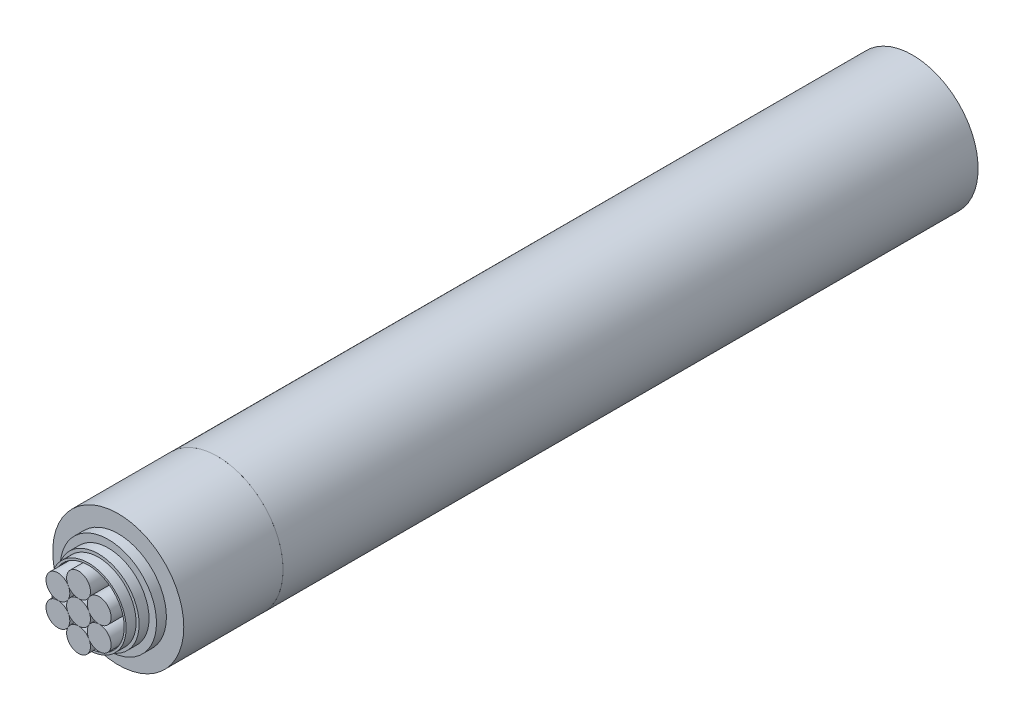
ISO-10303-21;
HEADER;
FILE_DESCRIPTION(('STEP AP214'),'2;1');
FILE_NAME('part.step','',(''),(''),'','','');
FILE_SCHEMA(('AUTOMOTIVE_DESIGN { 1 0 10303 214 1 1 1 1 }'));
ENDSEC;
DATA;
#1=APPLICATION_CONTEXT('core data for automotive mechanical design processes');
#2=APPLICATION_PROTOCOL_DEFINITION('international standard','automotive_design',2000,#1);
#3=PRODUCT_CONTEXT('',#1,'mechanical');
#4=PRODUCT('Part','Part','',(#3));
#5=PRODUCT_RELATED_PRODUCT_CATEGORY('part','',(#4));
#6=PRODUCT_DEFINITION_FORMATION('','',#4);
#7=PRODUCT_DEFINITION_CONTEXT('part definition',#1,'design');
#8=PRODUCT_DEFINITION('design','',#6,#7);
#9=PRODUCT_DEFINITION_SHAPE('','',#8);
#10=(LENGTH_UNIT() NAMED_UNIT(*) SI_UNIT(.MILLI.,.METRE.));
#11=(NAMED_UNIT(*) PLANE_ANGLE_UNIT() SI_UNIT($,.RADIAN.));
#12=(NAMED_UNIT(*) SI_UNIT($,.STERADIAN.) SOLID_ANGLE_UNIT());
#13=UNCERTAINTY_MEASURE_WITH_UNIT(LENGTH_MEASURE(1.E-05),#10,'distance_accuracy_value','');
#14=(GEOMETRIC_REPRESENTATION_CONTEXT(3) GLOBAL_UNCERTAINTY_ASSIGNED_CONTEXT((#13)) GLOBAL_UNIT_ASSIGNED_CONTEXT((#10,
#11,#12)) REPRESENTATION_CONTEXT('',''));
#15=CARTESIAN_POINT('',(0.,0.,0.));
#16=DIRECTION('',(0.,0.,1.));
#17=DIRECTION('',(1.,0.,0.));
#18=AXIS2_PLACEMENT_3D('',#15,#16,#17);
#19=CARTESIAN_POINT('',(0.,0.,-35.));
#20=DIRECTION('',(0.,0.,1.));
#21=DIRECTION('',(1.,0.,0.));
#22=AXIS2_PLACEMENT_3D('',#19,#20,#21);
#23=CYLINDRICAL_SURFACE('',#22,3.3);
#24=CARTESIAN_POINT('',(0.,0.,-35.));
#25=DIRECTION('',(0.,0.,-1.));
#26=DIRECTION('',(-1.,0.,0.));
#27=AXIS2_PLACEMENT_3D('',#24,#25,#26);
#28=CIRCLE('',#27,3.3);
#29=CARTESIAN_POINT('',(-3.3,0.,-35.));
#30=VERTEX_POINT('',#29);
#31=EDGE_CURVE('E12',#30,#30,#28,.T.);
#32=ORIENTED_EDGE('',*,*,#31,.F.);
#33=EDGE_LOOP('',(#32));
#34=FACE_BOUND('',#33,.T.);
#35=CARTESIAN_POINT('',(0.,0.,0.));
#36=DIRECTION('',(0.,0.,-1.));
#37=DIRECTION('',(-1.,0.,0.));
#38=AXIS2_PLACEMENT_3D('',#35,#36,#37);
#39=CIRCLE('',#38,3.3);
#40=CARTESIAN_POINT('',(-3.3,0.,0.));
#41=VERTEX_POINT('',#40);
#42=EDGE_CURVE('E125',#41,#41,#39,.T.);
#43=ORIENTED_EDGE('',*,*,#42,.T.);
#44=EDGE_LOOP('',(#43));
#45=FACE_BOUND('',#44,.T.);
#46=ADVANCED_FACE('F122',(#34,#45),#23,.T.);
#47=CARTESIAN_POINT('',(0.,0.,-35.));
#48=DIRECTION('',(0.,0.,-1.));
#49=DIRECTION('',(-1.,0.,0.));
#50=AXIS2_PLACEMENT_3D('',#47,#48,#49);
#51=PLANE('',#50);
#52=ORIENTED_EDGE('',*,*,#31,.T.);
#53=EDGE_LOOP('',(#52));
#54=FACE_BOUND('',#53,.T.);
#55=ADVANCED_FACE('F139',(#54),#51,.T.);
#56=CARTESIAN_POINT('',(0.,0.,0.));
#57=DIRECTION('',(0.,0.,-1.));
#58=DIRECTION('',(-1.,0.,0.));
#59=AXIS2_PLACEMENT_3D('',#56,#57,#58);
#60=PLANE('',#59);
#61=ORIENTED_EDGE('',*,*,#42,.F.);
#62=EDGE_LOOP('',(#61));
#63=FACE_BOUND('',#62,.T.);
#64=ADVANCED_FACE('F137',(#63),#60,.F.);
#65=CLOSED_SHELL('',(#46,#55,#64));
#66=MANIFOLD_SOLID_BREP('B2',#65);
#67=CARTESIAN_POINT('',(0.,0.,5.));
#68=DIRECTION('',(0.,0.,-1.));
#69=DIRECTION('',(-1.,0.,0.));
#70=AXIS2_PLACEMENT_3D('',#67,#68,#69);
#71=CYLINDRICAL_SURFACE('',#70,3.3);
#72=CARTESIAN_POINT('',(0.,0.,5.));
#73=DIRECTION('',(0.,0.,1.));
#74=DIRECTION('',(1.,0.,0.));
#75=AXIS2_PLACEMENT_3D('',#72,#73,#74);
#76=CIRCLE('',#75,3.3);
#77=CARTESIAN_POINT('',(3.3,0.,5.));
#78=VERTEX_POINT('',#77);
#79=EDGE_CURVE('E121',#78,#78,#76,.T.);
#80=ORIENTED_EDGE('',*,*,#79,.F.);
#81=EDGE_LOOP('',(#80));
#82=FACE_BOUND('',#81,.T.);
#83=CARTESIAN_POINT('',(0.,0.,0.));
#84=DIRECTION('',(0.,0.,1.));
#85=DIRECTION('',(1.,0.,0.));
#86=AXIS2_PLACEMENT_3D('',#83,#84,#85);
#87=CIRCLE('',#86,3.3);
#88=CARTESIAN_POINT('',(3.3,0.,0.));
#89=VERTEX_POINT('',#88);
#90=EDGE_CURVE('E175',#89,#89,#87,.T.);
#91=ORIENTED_EDGE('',*,*,#90,.T.);
#92=EDGE_LOOP('',(#91));
#93=FACE_BOUND('',#92,.T.);
#94=ADVANCED_FACE('F172',(#82,#93),#71,.T.);
#95=CARTESIAN_POINT('',(0.,0.,5.));
#96=DIRECTION('',(0.,0.,1.));
#97=DIRECTION('',(1.,0.,0.));
#98=AXIS2_PLACEMENT_3D('',#95,#96,#97);
#99=PLANE('',#98);
#100=CARTESIAN_POINT('',(0.,0.,5.));
#101=DIRECTION('',(0.,0.,1.));
#102=DIRECTION('',(1.,0.,0.));
#103=AXIS2_PLACEMENT_3D('',#100,#101,#102);
#104=CIRCLE('',#103,2.42499999999999);
#105=CARTESIAN_POINT('',(2.42499999999999,0.,5.));
#106=VERTEX_POINT('',#105);
#107=EDGE_CURVE('E179',#106,#106,#104,.T.);
#108=ORIENTED_EDGE('',*,*,#107,.F.);
#109=EDGE_LOOP('',(#108));
#110=FACE_BOUND('',#109,.T.);
#111=ORIENTED_EDGE('',*,*,#79,.T.);
#112=EDGE_LOOP('',(#111));
#113=FACE_BOUND('',#112,.T.);
#114=ADVANCED_FACE('F226',(#110,#113),#99,.T.);
#115=CARTESIAN_POINT('',(0.,0.,0.));
#116=DIRECTION('',(0.,0.,1.));
#117=DIRECTION('',(1.,0.,0.));
#118=AXIS2_PLACEMENT_3D('',#115,#116,#117);
#119=PLANE('',#118);
#120=ORIENTED_EDGE('',*,*,#90,.F.);
#121=EDGE_LOOP('',(#120));
#122=FACE_BOUND('',#121,.T.);
#123=CARTESIAN_POINT('',(0.,0.,0.));
#124=DIRECTION('',(0.,0.,1.));
#125=DIRECTION('',(1.,0.,0.));
#126=AXIS2_PLACEMENT_3D('',#123,#124,#125);
#127=CIRCLE('',#126,1.79999999999998);
#128=CARTESIAN_POINT('',(-1.79999999999998,0.,0.));
#129=VERTEX_POINT('',#128);
#130=EDGE_CURVE('E198',#129,#129,#127,.T.);
#131=ORIENTED_EDGE('',*,*,#130,.T.);
#132=EDGE_LOOP('',(#131));
#133=FACE_BOUND('',#132,.T.);
#134=ADVANCED_FACE('F231',(#122,#133),#119,.F.);
#135=CARTESIAN_POINT('',(0.,0.,5.5));
#136=DIRECTION('',(0.,0.,-1.));
#137=DIRECTION('',(-1.,0.,0.));
#138=AXIS2_PLACEMENT_3D('',#135,#136,#137);
#139=CYLINDRICAL_SURFACE('',#138,2.42499999999999);
#140=ORIENTED_EDGE('',*,*,#107,.T.);
#141=EDGE_LOOP('',(#140));
#142=FACE_BOUND('',#141,.T.);
#143=CARTESIAN_POINT('',(0.,0.,5.5));
#144=DIRECTION('',(0.,0.,1.));
#145=DIRECTION('',(1.,0.,0.));
#146=AXIS2_PLACEMENT_3D('',#143,#144,#145);
#147=CIRCLE('',#146,2.42499999999999);
#148=CARTESIAN_POINT('',(2.42499999999999,0.,5.5));
#149=VERTEX_POINT('',#148);
#150=EDGE_CURVE('E185',#149,#149,#147,.T.);
#151=ORIENTED_EDGE('',*,*,#150,.F.);
#152=EDGE_LOOP('',(#151));
#153=FACE_BOUND('',#152,.T.);
#154=ADVANCED_FACE('F240',(#142,#153),#139,.T.);
#155=CARTESIAN_POINT('',(0.,0.,5.5));
#156=DIRECTION('',(0.,0.,1.));
#157=DIRECTION('',(1.,0.,0.));
#158=AXIS2_PLACEMENT_3D('',#155,#156,#157);
#159=PLANE('',#158);
#160=CARTESIAN_POINT('',(0.,0.,5.5));
#161=DIRECTION('',(0.,0.,1.));
#162=DIRECTION('',(1.,0.,0.));
#163=AXIS2_PLACEMENT_3D('',#160,#161,#162);
#164=CIRCLE('',#163,2.04999999999999);
#165=CARTESIAN_POINT('',(2.04999999999999,0.,5.5));
#166=VERTEX_POINT('',#165);
#167=EDGE_CURVE('E188',#166,#166,#164,.T.);
#168=ORIENTED_EDGE('',*,*,#167,.F.);
#169=EDGE_LOOP('',(#168));
#170=FACE_BOUND('',#169,.T.);
#171=ORIENTED_EDGE('',*,*,#150,.T.);
#172=EDGE_LOOP('',(#171));
#173=FACE_BOUND('',#172,.T.);
#174=ADVANCED_FACE('F245',(#170,#173),#159,.T.);
#175=CARTESIAN_POINT('',(0.,0.,6.));
#176=DIRECTION('',(0.,0.,-1.));
#177=DIRECTION('',(-1.,0.,0.));
#178=AXIS2_PLACEMENT_3D('',#175,#176,#177);
#179=CYLINDRICAL_SURFACE('',#178,2.04999999999999);
#180=ORIENTED_EDGE('',*,*,#167,.T.);
#181=EDGE_LOOP('',(#180));
#182=FACE_BOUND('',#181,.T.);
#183=CARTESIAN_POINT('',(0.,0.,6.));
#184=DIRECTION('',(0.,0.,1.));
#185=DIRECTION('',(1.,0.,0.));
#186=AXIS2_PLACEMENT_3D('',#183,#184,#185);
#187=CIRCLE('',#186,2.04999999999999);
#188=CARTESIAN_POINT('',(2.04999999999999,0.,6.));
#189=VERTEX_POINT('',#188);
#190=EDGE_CURVE('E191',#189,#189,#187,.T.);
#191=ORIENTED_EDGE('',*,*,#190,.F.);
#192=EDGE_LOOP('',(#191));
#193=FACE_BOUND('',#192,.T.);
#194=ADVANCED_FACE('F251',(#182,#193),#179,.T.);
#195=CARTESIAN_POINT('',(0.,0.,6.));
#196=DIRECTION('',(0.,0.,1.));
#197=DIRECTION('',(1.,0.,0.));
#198=AXIS2_PLACEMENT_3D('',#195,#196,#197);
#199=PLANE('',#198);
#200=CARTESIAN_POINT('',(0.,0.,6.));
#201=DIRECTION('',(0.,0.,1.));
#202=DIRECTION('',(1.,0.,0.));
#203=AXIS2_PLACEMENT_3D('',#200,#201,#202);
#204=CIRCLE('',#203,1.89999999999999);
#205=CARTESIAN_POINT('',(-1.89999999999999,0.,6.));
#206=VERTEX_POINT('',#205);
#207=EDGE_CURVE('E194',#206,#206,#204,.T.);
#208=ORIENTED_EDGE('',*,*,#207,.F.);
#209=EDGE_LOOP('',(#208));
#210=FACE_BOUND('',#209,.T.);
#211=ORIENTED_EDGE('',*,*,#190,.T.);
#212=EDGE_LOOP('',(#211));
#213=FACE_BOUND('',#212,.T.);
#214=ADVANCED_FACE('F223',(#210,#213),#199,.T.);
#215=CARTESIAN_POINT('',(0.,0.,6.5));
#216=DIRECTION('',(0.,0.,-1.));
#217=DIRECTION('',(-1.,0.,0.));
#218=AXIS2_PLACEMENT_3D('',#215,#216,#217);
#219=CYLINDRICAL_SURFACE('',#218,1.79999999999998);
#220=CARTESIAN_POINT('',(0.,0.,6.5));
#221=DIRECTION('',(0.,0.,1.));
#222=DIRECTION('',(1.,0.,0.));
#223=AXIS2_PLACEMENT_3D('',#220,#221,#222);
#224=CIRCLE('',#223,1.79999999999998);
#225=CARTESIAN_POINT('',(-1.79999999999998,0.,6.5));
#226=VERTEX_POINT('',#225);
#227=EDGE_CURVE('E201',#226,#226,#224,.T.);
#228=CARTESIAN_POINT('',(-1.79999999999998,0.,6.5));
#229=CARTESIAN_POINT('',(-1.79999999999998,0.,6.43229166666667));
#230=CARTESIAN_POINT('',(-1.79999999999998,0.,6.36458333333333));
#231=CARTESIAN_POINT('',(-1.79999999999998,0.,6.22916666666667));
#232=CARTESIAN_POINT('',(-1.79999999999998,0.,6.16145833333333));
#233=CARTESIAN_POINT('',(-1.79999999999998,0.,6.02604166666667));
#234=CARTESIAN_POINT('',(-1.79999999999998,0.,5.95833333333333));
#235=CARTESIAN_POINT('',(-1.79999999999998,0.,5.82291666666667));
#236=CARTESIAN_POINT('',(-1.79999999999998,0.,5.75520833333333));
#237=CARTESIAN_POINT('',(-1.79999999999998,0.,5.61979166666667));
#238=CARTESIAN_POINT('',(-1.79999999999998,0.,5.55208333333333));
#239=CARTESIAN_POINT('',(-1.79999999999998,0.,5.41666666666667));
#240=CARTESIAN_POINT('',(-1.79999999999998,0.,5.34895833333333));
#241=CARTESIAN_POINT('',(-1.79999999999998,0.,5.21354166666667));
#242=CARTESIAN_POINT('',(-1.79999999999998,0.,5.14583333333333));
#243=CARTESIAN_POINT('',(-1.79999999999998,0.,5.01041666666667));
#244=CARTESIAN_POINT('',(-1.79999999999998,0.,4.94270833333333));
#245=CARTESIAN_POINT('',(-1.79999999999998,0.,4.80729166666667));
#246=CARTESIAN_POINT('',(-1.79999999999998,0.,4.73958333333333));
#247=CARTESIAN_POINT('',(-1.79999999999998,0.,4.60416666666667));
#248=CARTESIAN_POINT('',(-1.79999999999998,0.,4.53645833333333));
#249=CARTESIAN_POINT('',(-1.79999999999998,0.,4.40104166666667));
#250=CARTESIAN_POINT('',(-1.79999999999998,0.,4.33333333333333));
#251=CARTESIAN_POINT('',(-1.79999999999998,0.,4.19791666666667));
#252=CARTESIAN_POINT('',(-1.79999999999998,0.,4.13020833333333));
#253=CARTESIAN_POINT('',(-1.79999999999998,0.,3.99479166666667));
#254=CARTESIAN_POINT('',(-1.79999999999998,0.,3.92708333333333));
#255=CARTESIAN_POINT('',(-1.79999999999998,0.,3.79166666666667));
#256=CARTESIAN_POINT('',(-1.79999999999998,0.,3.72395833333333));
#257=CARTESIAN_POINT('',(-1.79999999999998,0.,3.58854166666667));
#258=CARTESIAN_POINT('',(-1.79999999999998,0.,3.52083333333333));
#259=CARTESIAN_POINT('',(-1.79999999999998,0.,3.38541666666667));
#260=CARTESIAN_POINT('',(-1.79999999999998,0.,3.31770833333333));
#261=CARTESIAN_POINT('',(-1.79999999999998,0.,3.18229166666667));
#262=CARTESIAN_POINT('',(-1.79999999999998,0.,3.11458333333333));
#263=CARTESIAN_POINT('',(-1.79999999999998,0.,2.97916666666667));
#264=CARTESIAN_POINT('',(-1.79999999999998,0.,2.91145833333333));
#265=CARTESIAN_POINT('',(-1.79999999999998,0.,2.77604166666667));
#266=CARTESIAN_POINT('',(-1.79999999999998,0.,2.70833333333333));
#267=CARTESIAN_POINT('',(-1.79999999999998,0.,2.57291666666667));
#268=CARTESIAN_POINT('',(-1.79999999999998,0.,2.50520833333333));
#269=CARTESIAN_POINT('',(-1.79999999999998,0.,2.36979166666667));
#270=CARTESIAN_POINT('',(-1.79999999999998,0.,2.30208333333333));
#271=CARTESIAN_POINT('',(-1.79999999999998,0.,2.16666666666667));
#272=CARTESIAN_POINT('',(-1.79999999999998,0.,2.09895833333333));
#273=CARTESIAN_POINT('',(-1.79999999999998,0.,1.96354166666667));
#274=CARTESIAN_POINT('',(-1.79999999999998,0.,1.89583333333333));
#275=CARTESIAN_POINT('',(-1.79999999999998,0.,1.76041666666667));
#276=CARTESIAN_POINT('',(-1.79999999999998,0.,1.69270833333333));
#277=CARTESIAN_POINT('',(-1.79999999999998,0.,1.55729166666667));
#278=CARTESIAN_POINT('',(-1.79999999999998,0.,1.48958333333333));
#279=CARTESIAN_POINT('',(-1.79999999999998,0.,1.35416666666667));
#280=CARTESIAN_POINT('',(-1.79999999999998,0.,1.28645833333333));
#281=CARTESIAN_POINT('',(-1.79999999999998,0.,1.15104166666667));
#282=CARTESIAN_POINT('',(-1.79999999999998,0.,1.08333333333333));
#283=CARTESIAN_POINT('',(-1.79999999999998,0.,0.947916666666667));
#284=CARTESIAN_POINT('',(-1.79999999999998,0.,0.880208333333333));
#285=CARTESIAN_POINT('',(-1.79999999999998,0.,0.744791666666667));
#286=CARTESIAN_POINT('',(-1.79999999999998,0.,0.677083333333333));
#287=CARTESIAN_POINT('',(-1.79999999999998,0.,0.541666666666667));
#288=CARTESIAN_POINT('',(-1.79999999999998,0.,0.473958333333333));
#289=CARTESIAN_POINT('',(-1.79999999999998,0.,0.338541666666667));
#290=CARTESIAN_POINT('',(-1.79999999999998,0.,0.270833333333334));
#291=CARTESIAN_POINT('',(-1.79999999999998,0.,0.135416666666667));
#292=CARTESIAN_POINT('',(-1.79999999999998,0.,0.0677083333333334));
#293=CARTESIAN_POINT('',(-1.79999999999998,0.,0.));
#294=B_SPLINE_CURVE_WITH_KNOTS('',3,(#228,#229,#230,#231,#232,#233,#234,#235,#236,#237,#238,
#239,#240,#241,#242,#243,#244,#245,#246,#247,#248,#249,#250,#251,#252,#253,#254,#255,#256,#257,
#258,#259,#260,#261,#262,#263,#264,#265,#266,#267,#268,#269,#270,#271,#272,#273,#274,#275,#276,
#277,#278,#279,#280,#281,#282,#283,#284,#285,#286,#287,#288,#289,#290,#291,#292,#293),
.UNSPECIFIED.,.F.,.F.,(4,2,2,2,2,2,2,2,2,2,2,2,2,2,2,2,2,2,2,2,2,2,2,2,2,2,2,2,2,2,2,2,4),(0.,
0.203124999999999,0.40625,0.609375,0.812499999999999,1.015625,1.21875,1.421875,1.625,1.828125,
2.03125,2.234375,2.4375,2.640625,2.84375,3.046875,3.25,3.453125,3.65625,3.859375,4.0625,
4.265625,4.46875,4.671875,4.875,5.078125,5.28125,5.484375,5.6875,5.890625,6.09375,6.296875,6.5),.UNSPECIFIED.);
#295=EDGE_CURVE('BSEAM207',#226,#129,#294,.T.);
#296=ORIENTED_EDGE('',*,*,#227,.T.);
#297=ORIENTED_EDGE('',*,*,#130,.F.);
#298=ORIENTED_EDGE('',*,*,#295,.T.);
#299=ORIENTED_EDGE('',*,*,#295,.F.);
#300=EDGE_LOOP('',(#296,#298,#297,#299));
#301=FACE_BOUND('',#300,.T.);
#302=ADVANCED_FACE('F207',(#301),#219,.F.);
#303=CARTESIAN_POINT('',(0.,0.,6.5));
#304=DIRECTION('',(0.,0.,-1.));
#305=DIRECTION('',(-1.,0.,0.));
#306=AXIS2_PLACEMENT_3D('',#303,#304,#305);
#307=CYLINDRICAL_SURFACE('',#306,1.89999999999999);
#308=CARTESIAN_POINT('',(0.,0.,6.5));
#309=DIRECTION('',(0.,0.,1.));
#310=DIRECTION('',(1.,0.,0.));
#311=AXIS2_PLACEMENT_3D('',#308,#309,#310);
#312=CIRCLE('',#311,1.89999999999999);
#313=CARTESIAN_POINT('',(-1.89999999999999,0.,6.5));
#314=VERTEX_POINT('',#313);
#315=EDGE_CURVE('E197',#314,#314,#312,.T.);
#316=CARTESIAN_POINT('',(-1.89999999999999,0.,6.));
#317=CARTESIAN_POINT('',(-1.89999999999999,0.,6.00520833333333));
#318=CARTESIAN_POINT('',(-1.89999999999999,0.,6.01041666666667));
#319=CARTESIAN_POINT('',(-1.89999999999999,0.,6.02083333333333));
#320=CARTESIAN_POINT('',(-1.89999999999999,0.,6.02604166666667));
#321=CARTESIAN_POINT('',(-1.89999999999999,0.,6.03645833333333));
#322=CARTESIAN_POINT('',(-1.89999999999999,0.,6.04166666666667));
#323=CARTESIAN_POINT('',(-1.89999999999999,0.,6.05208333333333));
#324=CARTESIAN_POINT('',(-1.89999999999999,0.,6.05729166666667));
#325=CARTESIAN_POINT('',(-1.89999999999999,0.,6.06770833333333));
#326=CARTESIAN_POINT('',(-1.89999999999999,0.,6.07291666666667));
#327=CARTESIAN_POINT('',(-1.89999999999999,0.,6.08333333333333));
#328=CARTESIAN_POINT('',(-1.89999999999999,0.,6.08854166666667));
#329=CARTESIAN_POINT('',(-1.89999999999999,0.,6.09895833333333));
#330=CARTESIAN_POINT('',(-1.89999999999999,0.,6.10416666666667));
#331=CARTESIAN_POINT('',(-1.89999999999999,0.,6.11458333333333));
#332=CARTESIAN_POINT('',(-1.89999999999999,0.,6.11979166666667));
#333=CARTESIAN_POINT('',(-1.89999999999999,0.,6.13020833333333));
#334=CARTESIAN_POINT('',(-1.89999999999999,0.,6.13541666666667));
#335=CARTESIAN_POINT('',(-1.89999999999999,0.,6.14583333333333));
#336=CARTESIAN_POINT('',(-1.89999999999999,0.,6.15104166666667));
#337=CARTESIAN_POINT('',(-1.89999999999999,0.,6.16145833333333));
#338=CARTESIAN_POINT('',(-1.89999999999999,0.,6.16666666666667));
#339=CARTESIAN_POINT('',(-1.89999999999999,0.,6.17708333333333));
#340=CARTESIAN_POINT('',(-1.89999999999999,0.,6.18229166666667));
#341=CARTESIAN_POINT('',(-1.89999999999999,0.,6.19270833333333));
#342=CARTESIAN_POINT('',(-1.89999999999999,0.,6.19791666666667));
#343=CARTESIAN_POINT('',(-1.89999999999999,0.,6.20833333333333));
#344=CARTESIAN_POINT('',(-1.89999999999999,0.,6.21354166666667));
#345=CARTESIAN_POINT('',(-1.89999999999999,0.,6.22395833333333));
#346=CARTESIAN_POINT('',(-1.89999999999999,0.,6.22916666666667));
#347=CARTESIAN_POINT('',(-1.89999999999999,0.,6.23958333333333));
#348=CARTESIAN_POINT('',(-1.89999999999999,0.,6.24479166666667));
#349=CARTESIAN_POINT('',(-1.89999999999999,0.,6.25520833333333));
#350=CARTESIAN_POINT('',(-1.89999999999999,0.,6.26041666666667));
#351=CARTESIAN_POINT('',(-1.89999999999999,0.,6.27083333333333));
#352=CARTESIAN_POINT('',(-1.89999999999999,0.,6.27604166666667));
#353=CARTESIAN_POINT('',(-1.89999999999999,0.,6.28645833333333));
#354=CARTESIAN_POINT('',(-1.89999999999999,0.,6.29166666666667));
#355=CARTESIAN_POINT('',(-1.89999999999999,0.,6.30208333333333));
#356=CARTESIAN_POINT('',(-1.89999999999999,0.,6.30729166666667));
#357=CARTESIAN_POINT('',(-1.89999999999999,0.,6.31770833333333));
#358=CARTESIAN_POINT('',(-1.89999999999999,0.,6.32291666666667));
#359=CARTESIAN_POINT('',(-1.89999999999999,0.,6.33333333333333));
#360=CARTESIAN_POINT('',(-1.89999999999999,0.,6.33854166666667));
#361=CARTESIAN_POINT('',(-1.89999999999999,0.,6.34895833333333));
#362=CARTESIAN_POINT('',(-1.89999999999999,0.,6.35416666666667));
#363=CARTESIAN_POINT('',(-1.89999999999999,0.,6.36458333333333));
#364=CARTESIAN_POINT('',(-1.89999999999999,0.,6.36979166666667));
#365=CARTESIAN_POINT('',(-1.89999999999999,0.,6.38020833333333));
#366=CARTESIAN_POINT('',(-1.89999999999999,0.,6.38541666666667));
#367=CARTESIAN_POINT('',(-1.89999999999999,0.,6.39583333333333));
#368=CARTESIAN_POINT('',(-1.89999999999999,0.,6.40104166666667));
#369=CARTESIAN_POINT('',(-1.89999999999999,0.,6.41145833333333));
#370=CARTESIAN_POINT('',(-1.89999999999999,0.,6.41666666666667));
#371=CARTESIAN_POINT('',(-1.89999999999999,0.,6.42708333333333));
#372=CARTESIAN_POINT('',(-1.89999999999999,0.,6.43229166666667));
#373=CARTESIAN_POINT('',(-1.89999999999999,0.,6.44270833333333));
#374=CARTESIAN_POINT('',(-1.89999999999999,0.,6.44791666666667));
#375=CARTESIAN_POINT('',(-1.89999999999999,0.,6.45833333333333));
#376=CARTESIAN_POINT('',(-1.89999999999999,0.,6.46354166666667));
#377=CARTESIAN_POINT('',(-1.89999999999999,0.,6.47395833333333));
#378=CARTESIAN_POINT('',(-1.89999999999999,0.,6.47916666666667));
#379=CARTESIAN_POINT('',(-1.89999999999999,0.,6.48958333333333));
#380=CARTESIAN_POINT('',(-1.89999999999999,0.,6.49479166666667));
#381=CARTESIAN_POINT('',(-1.89999999999999,0.,6.5));
#382=B_SPLINE_CURVE_WITH_KNOTS('',3,(#316,#317,#318,#319,#320,#321,#322,#323,#324,#325,#326,
#327,#328,#329,#330,#331,#332,#333,#334,#335,#336,#337,#338,#339,#340,#341,#342,#343,#344,#345,
#346,#347,#348,#349,#350,#351,#352,#353,#354,#355,#356,#357,#358,#359,#360,#361,#362,#363,#364,
#365,#366,#367,#368,#369,#370,#371,#372,#373,#374,#375,#376,#377,#378,#379,#380,#381),
.UNSPECIFIED.,.F.,.F.,(4,2,2,2,2,2,2,2,2,2,2,2,2,2,2,2,2,2,2,2,2,2,2,2,2,2,2,2,2,2,2,2,4),(0.,
0.015625,0.03125,0.046875,0.0625000000000001,0.0781250000000001,0.0937500000000001,0.109375,
0.125,0.140625,0.15625,0.171875,0.1875,0.203125,0.21875,0.234375,0.25,0.265625,0.28125,0.296875,
0.3125,0.328125,0.34375,0.359375,0.375,0.390625,0.40625,0.421875,0.4375,0.453125,0.46875,
0.484375,0.5),.UNSPECIFIED.);
#383=EDGE_CURVE('BSEAM213',#206,#314,#382,.T.);
#384=ORIENTED_EDGE('',*,*,#207,.T.);
#385=ORIENTED_EDGE('',*,*,#315,.F.);
#386=ORIENTED_EDGE('',*,*,#383,.T.);
#387=ORIENTED_EDGE('',*,*,#383,.F.);
#388=EDGE_LOOP('',(#384,#386,#385,#387));
#389=FACE_BOUND('',#388,.T.);
#390=ADVANCED_FACE('F213',(#389),#307,.T.);
#391=CARTESIAN_POINT('',(0.,0.,6.5));
#392=DIRECTION('',(0.,0.,1.));
#393=DIRECTION('',(1.,0.,0.));
#394=AXIS2_PLACEMENT_3D('',#391,#392,#393);
#395=PLANE('',#394);
#396=ORIENTED_EDGE('',*,*,#227,.F.);
#397=EDGE_LOOP('',(#396));
#398=FACE_BOUND('',#397,.T.);
#399=ORIENTED_EDGE('',*,*,#315,.T.);
#400=EDGE_LOOP('',(#399));
#401=FACE_BOUND('',#400,.T.);
#402=ADVANCED_FACE('F210',(#398,#401),#395,.T.);
#403=CLOSED_SHELL('',(#94,#114,#134,#154,#174,#194,#214,#302,#390,#402));
#404=MANIFOLD_SOLID_BREP('B7',#403);
#405=CARTESIAN_POINT('',(0.,1.2,7.));
#406=DIRECTION('',(0.,0.,-1.));
#407=DIRECTION('',(-1.,0.,0.));
#408=AXIS2_PLACEMENT_3D('',#405,#406,#407);
#409=CYLINDRICAL_SURFACE('',#408,0.6);
#410=CARTESIAN_POINT('',(0.,1.2,7.));
#411=DIRECTION('',(0.,0.,1.));
#412=DIRECTION('',(1.,0.,0.));
#413=AXIS2_PLACEMENT_3D('',#410,#411,#412);
#414=CIRCLE('',#413,0.6);
#415=CARTESIAN_POINT('',(0.6,1.2,7.));
#416=VERTEX_POINT('',#415);
#417=EDGE_CURVE('E171',#416,#416,#414,.T.);
#418=ORIENTED_EDGE('',*,*,#417,.F.);
#419=EDGE_LOOP('',(#418));
#420=FACE_BOUND('',#419,.T.);
#421=CARTESIAN_POINT('',(0.,1.2,0.));
#422=DIRECTION('',(0.,0.,1.));
#423=DIRECTION('',(1.,0.,0.));
#424=AXIS2_PLACEMENT_3D('',#421,#422,#423);
#425=CIRCLE('',#424,0.6);
#426=CARTESIAN_POINT('',(0.6,1.2,0.));
#427=VERTEX_POINT('',#426);
#428=EDGE_CURVE('E359',#427,#427,#425,.T.);
#429=ORIENTED_EDGE('',*,*,#428,.T.);
#430=EDGE_LOOP('',(#429));
#431=FACE_BOUND('',#430,.T.);
#432=ADVANCED_FACE('F356',(#420,#431),#409,.T.);
#433=CARTESIAN_POINT('',(0.,0.,7.));
#434=DIRECTION('',(0.,0.,1.));
#435=DIRECTION('',(1.,0.,0.));
#436=AXIS2_PLACEMENT_3D('',#433,#434,#435);
#437=PLANE('',#436);
#438=ORIENTED_EDGE('',*,*,#417,.T.);
#439=EDGE_LOOP('',(#438));
#440=FACE_BOUND('',#439,.T.);
#441=ADVANCED_FACE('F371',(#440),#437,.T.);
#442=CARTESIAN_POINT('',(0.,0.,0.));
#443=DIRECTION('',(0.,0.,1.));
#444=DIRECTION('',(1.,0.,0.));
#445=AXIS2_PLACEMENT_3D('',#442,#443,#444);
#446=PLANE('',#445);
#447=ORIENTED_EDGE('',*,*,#428,.F.);
#448=EDGE_LOOP('',(#447));
#449=FACE_BOUND('',#448,.T.);
#450=ADVANCED_FACE('F369',(#449),#446,.F.);
#451=CLOSED_SHELL('',(#432,#441,#450));
#452=MANIFOLD_SOLID_BREP('B116',#451);
#453=CARTESIAN_POINT('',(1.03923048454131,0.6,7.));
#454=DIRECTION('',(0.,0.,-1.));
#455=DIRECTION('',(-1.,0.,0.));
#456=AXIS2_PLACEMENT_3D('',#453,#454,#455);
#457=CYLINDRICAL_SURFACE('',#456,0.600000000000014);
#458=CARTESIAN_POINT('',(1.03923048454131,0.6,7.));
#459=DIRECTION('',(0.,0.,1.));
#460=DIRECTION('',(1.,0.,0.));
#461=AXIS2_PLACEMENT_3D('',#458,#459,#460);
#462=CIRCLE('',#461,0.600000000000014);
#463=CARTESIAN_POINT('',(1.63923048454133,0.6,7.));
#464=VERTEX_POINT('',#463);
#465=EDGE_CURVE('E355',#464,#464,#462,.T.);
#466=ORIENTED_EDGE('',*,*,#465,.F.);
#467=EDGE_LOOP('',(#466));
#468=FACE_BOUND('',#467,.T.);
#469=CARTESIAN_POINT('',(1.03923048454131,0.6,0.));
#470=DIRECTION('',(0.,0.,1.));
#471=DIRECTION('',(1.,0.,0.));
#472=AXIS2_PLACEMENT_3D('',#469,#470,#471);
#473=CIRCLE('',#472,0.600000000000014);
#474=CARTESIAN_POINT('',(1.63923048454133,0.6,0.));
#475=VERTEX_POINT('',#474);
#476=EDGE_CURVE('E411',#475,#475,#473,.T.);
#477=ORIENTED_EDGE('',*,*,#476,.T.);
#478=EDGE_LOOP('',(#477));
#479=FACE_BOUND('',#478,.T.);
#480=ADVANCED_FACE('F408',(#468,#479),#457,.T.);
#481=CARTESIAN_POINT('',(0.,0.,7.));
#482=DIRECTION('',(0.,0.,1.));
#483=DIRECTION('',(1.,0.,0.));
#484=AXIS2_PLACEMENT_3D('',#481,#482,#483);
#485=PLANE('',#484);
#486=ORIENTED_EDGE('',*,*,#465,.T.);
#487=EDGE_LOOP('',(#486));
#488=FACE_BOUND('',#487,.T.);
#489=ADVANCED_FACE('F423',(#488),#485,.T.);
#490=CARTESIAN_POINT('',(0.,0.,0.));
#491=DIRECTION('',(0.,0.,1.));
#492=DIRECTION('',(1.,0.,0.));
#493=AXIS2_PLACEMENT_3D('',#490,#491,#492);
#494=PLANE('',#493);
#495=ORIENTED_EDGE('',*,*,#476,.F.);
#496=EDGE_LOOP('',(#495));
#497=FACE_BOUND('',#496,.T.);
#498=ADVANCED_FACE('F421',(#497),#494,.F.);
#499=CLOSED_SHELL('',(#480,#489,#498));
#500=MANIFOLD_SOLID_BREP('B166',#499);
#501=CARTESIAN_POINT('',(0.,0.,7.));
#502=DIRECTION('',(0.,0.,-1.));
#503=DIRECTION('',(-1.,0.,0.));
#504=AXIS2_PLACEMENT_3D('',#501,#502,#503);
#505=CYLINDRICAL_SURFACE('',#504,0.6);
#506=CARTESIAN_POINT('',(0.,0.,7.));
#507=DIRECTION('',(0.,0.,1.));
#508=DIRECTION('',(1.,0.,0.));
#509=AXIS2_PLACEMENT_3D('',#506,#507,#508);
#510=CIRCLE('',#509,0.6);
#511=CARTESIAN_POINT('',(0.6,0.,7.));
#512=VERTEX_POINT('',#511);
#513=EDGE_CURVE('E407',#512,#512,#510,.T.);
#514=ORIENTED_EDGE('',*,*,#513,.F.);
#515=EDGE_LOOP('',(#514));
#516=FACE_BOUND('',#515,.T.);
#517=CARTESIAN_POINT('',(0.,0.,0.));
#518=DIRECTION('',(0.,0.,1.));
#519=DIRECTION('',(1.,0.,0.));
#520=AXIS2_PLACEMENT_3D('',#517,#518,#519);
#521=CIRCLE('',#520,0.6);
#522=CARTESIAN_POINT('',(0.6,0.,0.));
#523=VERTEX_POINT('',#522);
#524=EDGE_CURVE('E463',#523,#523,#521,.T.);
#525=ORIENTED_EDGE('',*,*,#524,.T.);
#526=EDGE_LOOP('',(#525));
#527=FACE_BOUND('',#526,.T.);
#528=ADVANCED_FACE('F460',(#516,#527),#505,.T.);
#529=CARTESIAN_POINT('',(0.,0.,7.));
#530=DIRECTION('',(0.,0.,1.));
#531=DIRECTION('',(1.,0.,0.));
#532=AXIS2_PLACEMENT_3D('',#529,#530,#531);
#533=PLANE('',#532);
#534=ORIENTED_EDGE('',*,*,#513,.T.);
#535=EDGE_LOOP('',(#534));
#536=FACE_BOUND('',#535,.T.);
#537=ADVANCED_FACE('F475',(#536),#533,.T.);
#538=CARTESIAN_POINT('',(0.,0.,0.));
#539=DIRECTION('',(0.,0.,1.));
#540=DIRECTION('',(1.,0.,0.));
#541=AXIS2_PLACEMENT_3D('',#538,#539,#540);
#542=PLANE('',#541);
#543=ORIENTED_EDGE('',*,*,#524,.F.);
#544=EDGE_LOOP('',(#543));
#545=FACE_BOUND('',#544,.T.);
#546=ADVANCED_FACE('F473',(#545),#542,.F.);
#547=CLOSED_SHELL('',(#528,#537,#546));
#548=MANIFOLD_SOLID_BREP('B350',#547);
#549=CARTESIAN_POINT('',(-1.03923048454132,0.600000000000012,7.));
#550=DIRECTION('',(0.,0.,-1.));
#551=DIRECTION('',(-1.,0.,0.));
#552=AXIS2_PLACEMENT_3D('',#549,#550,#551);
#553=CYLINDRICAL_SURFACE('',#552,0.6);
#554=CARTESIAN_POINT('',(-1.03923048454132,0.600000000000012,7.));
#555=DIRECTION('',(0.,0.,1.));
#556=DIRECTION('',(1.,0.,0.));
#557=AXIS2_PLACEMENT_3D('',#554,#555,#556);
#558=CIRCLE('',#557,0.6);
#559=CARTESIAN_POINT('',(-0.439230484541319,0.600000000000012,7.));
#560=VERTEX_POINT('',#559);
#561=EDGE_CURVE('E459',#560,#560,#558,.T.);
#562=ORIENTED_EDGE('',*,*,#561,.F.);
#563=EDGE_LOOP('',(#562));
#564=FACE_BOUND('',#563,.T.);
#565=CARTESIAN_POINT('',(-1.03923048454132,0.600000000000012,0.));
#566=DIRECTION('',(0.,0.,1.));
#567=DIRECTION('',(1.,0.,0.));
#568=AXIS2_PLACEMENT_3D('',#565,#566,#567);
#569=CIRCLE('',#568,0.6);
#570=CARTESIAN_POINT('',(-0.439230484541319,0.600000000000012,0.));
#571=VERTEX_POINT('',#570);
#572=EDGE_CURVE('E515',#571,#571,#569,.T.);
#573=ORIENTED_EDGE('',*,*,#572,.T.);
#574=EDGE_LOOP('',(#573));
#575=FACE_BOUND('',#574,.T.);
#576=ADVANCED_FACE('F512',(#564,#575),#553,.T.);
#577=CARTESIAN_POINT('',(0.,0.,7.));
#578=DIRECTION('',(0.,0.,1.));
#579=DIRECTION('',(1.,0.,0.));
#580=AXIS2_PLACEMENT_3D('',#577,#578,#579);
#581=PLANE('',#580);
#582=ORIENTED_EDGE('',*,*,#561,.T.);
#583=EDGE_LOOP('',(#582));
#584=FACE_BOUND('',#583,.T.);
#585=ADVANCED_FACE('F527',(#584),#581,.T.);
#586=CARTESIAN_POINT('',(0.,0.,0.));
#587=DIRECTION('',(0.,0.,1.));
#588=DIRECTION('',(1.,0.,0.));
#589=AXIS2_PLACEMENT_3D('',#586,#587,#588);
#590=PLANE('',#589);
#591=ORIENTED_EDGE('',*,*,#572,.F.);
#592=EDGE_LOOP('',(#591));
#593=FACE_BOUND('',#592,.T.);
#594=ADVANCED_FACE('F525',(#593),#590,.F.);
#595=CLOSED_SHELL('',(#576,#585,#594));
#596=MANIFOLD_SOLID_BREP('B402',#595);
#597=CARTESIAN_POINT('',(-1.03923048454133,-0.599999999999975,7.));
#598=DIRECTION('',(0.,0.,-1.));
#599=DIRECTION('',(-1.,0.,0.));
#600=AXIS2_PLACEMENT_3D('',#597,#598,#599);
#601=CYLINDRICAL_SURFACE('',#600,0.599999999999994);
#602=CARTESIAN_POINT('',(-1.03923048454133,-0.599999999999975,7.));
#603=DIRECTION('',(0.,0.,1.));
#604=DIRECTION('',(1.,0.,0.));
#605=AXIS2_PLACEMENT_3D('',#602,#603,#604);
#606=CIRCLE('',#605,0.599999999999994);
#607=CARTESIAN_POINT('',(-0.439230484541333,-0.599999999999975,7.));
#608=VERTEX_POINT('',#607);
#609=EDGE_CURVE('E511',#608,#608,#606,.T.);
#610=ORIENTED_EDGE('',*,*,#609,.F.);
#611=EDGE_LOOP('',(#610));
#612=FACE_BOUND('',#611,.T.);
#613=CARTESIAN_POINT('',(-1.03923048454133,-0.599999999999975,0.));
#614=DIRECTION('',(0.,0.,1.));
#615=DIRECTION('',(1.,0.,0.));
#616=AXIS2_PLACEMENT_3D('',#613,#614,#615);
#617=CIRCLE('',#616,0.599999999999994);
#618=CARTESIAN_POINT('',(-0.439230484541333,-0.599999999999975,0.));
#619=VERTEX_POINT('',#618);
#620=EDGE_CURVE('E567',#619,#619,#617,.T.);
#621=ORIENTED_EDGE('',*,*,#620,.T.);
#622=EDGE_LOOP('',(#621));
#623=FACE_BOUND('',#622,.T.);
#624=ADVANCED_FACE('F564',(#612,#623),#601,.T.);
#625=CARTESIAN_POINT('',(0.,0.,7.));
#626=DIRECTION('',(0.,0.,1.));
#627=DIRECTION('',(1.,0.,0.));
#628=AXIS2_PLACEMENT_3D('',#625,#626,#627);
#629=PLANE('',#628);
#630=ORIENTED_EDGE('',*,*,#609,.T.);
#631=EDGE_LOOP('',(#630));
#632=FACE_BOUND('',#631,.T.);
#633=ADVANCED_FACE('F579',(#632),#629,.T.);
#634=CARTESIAN_POINT('',(0.,0.,0.));
#635=DIRECTION('',(0.,0.,1.));
#636=DIRECTION('',(1.,0.,0.));
#637=AXIS2_PLACEMENT_3D('',#634,#635,#636);
#638=PLANE('',#637);
#639=ORIENTED_EDGE('',*,*,#620,.F.);
#640=EDGE_LOOP('',(#639));
#641=FACE_BOUND('',#640,.T.);
#642=ADVANCED_FACE('F577',(#641),#638,.F.);
#643=CLOSED_SHELL('',(#624,#633,#642));
#644=MANIFOLD_SOLID_BREP('B454',#643);
#645=CARTESIAN_POINT('',(0.,-1.19999999999997,7.));
#646=DIRECTION('',(0.,0.,-1.));
#647=DIRECTION('',(-1.,0.,0.));
#648=AXIS2_PLACEMENT_3D('',#645,#646,#647);
#649=CYLINDRICAL_SURFACE('',#648,0.600000000000001);
#650=CARTESIAN_POINT('',(0.,-1.19999999999997,7.));
#651=DIRECTION('',(0.,0.,1.));
#652=DIRECTION('',(1.,0.,0.));
#653=AXIS2_PLACEMENT_3D('',#650,#651,#652);
#654=CIRCLE('',#653,0.600000000000001);
#655=CARTESIAN_POINT('',(0.599999999999987,-1.19999999999997,7.));
#656=VERTEX_POINT('',#655);
#657=EDGE_CURVE('E563',#656,#656,#654,.T.);
#658=ORIENTED_EDGE('',*,*,#657,.F.);
#659=EDGE_LOOP('',(#658));
#660=FACE_BOUND('',#659,.T.);
#661=CARTESIAN_POINT('',(0.,-1.19999999999997,0.));
#662=DIRECTION('',(0.,0.,1.));
#663=DIRECTION('',(1.,0.,0.));
#664=AXIS2_PLACEMENT_3D('',#661,#662,#663);
#665=CIRCLE('',#664,0.600000000000001);
#666=CARTESIAN_POINT('',(0.599999999999987,-1.19999999999997,0.));
#667=VERTEX_POINT('',#666);
#668=EDGE_CURVE('E618',#667,#667,#665,.T.);
#669=ORIENTED_EDGE('',*,*,#668,.T.);
#670=EDGE_LOOP('',(#669));
#671=FACE_BOUND('',#670,.T.);
#672=ADVANCED_FACE('F615',(#660,#671),#649,.T.);
#673=CARTESIAN_POINT('',(0.,0.,7.));
#674=DIRECTION('',(0.,0.,1.));
#675=DIRECTION('',(1.,0.,0.));
#676=AXIS2_PLACEMENT_3D('',#673,#674,#675);
#677=PLANE('',#676);
#678=ORIENTED_EDGE('',*,*,#657,.T.);
#679=EDGE_LOOP('',(#678));
#680=FACE_BOUND('',#679,.T.);
#681=ADVANCED_FACE('F630',(#680),#677,.T.);
#682=CARTESIAN_POINT('',(0.,0.,0.));
#683=DIRECTION('',(0.,0.,1.));
#684=DIRECTION('',(1.,0.,0.));
#685=AXIS2_PLACEMENT_3D('',#682,#683,#684);
#686=PLANE('',#685);
#687=ORIENTED_EDGE('',*,*,#668,.F.);
#688=EDGE_LOOP('',(#687));
#689=FACE_BOUND('',#688,.T.);
#690=ADVANCED_FACE('F628',(#689),#686,.F.);
#691=CLOSED_SHELL('',(#672,#681,#690));
#692=MANIFOLD_SOLID_BREP('B506',#691);
#693=CARTESIAN_POINT('',(1.0392304845413,-0.599999999999987,7.));
#694=DIRECTION('',(0.,0.,-1.));
#695=DIRECTION('',(-1.,0.,0.));
#696=AXIS2_PLACEMENT_3D('',#693,#694,#695);
#697=CYLINDRICAL_SURFACE('',#696,0.600000000000013);
#698=CARTESIAN_POINT('',(1.0392304845413,-0.599999999999987,7.));
#699=DIRECTION('',(0.,0.,1.));
#700=DIRECTION('',(1.,0.,0.));
#701=AXIS2_PLACEMENT_3D('',#698,#699,#700);
#702=CIRCLE('',#701,0.600000000000013);
#703=CARTESIAN_POINT('',(1.63923048454132,-0.599999999999987,7.));
#704=VERTEX_POINT('',#703);
#705=EDGE_CURVE('E614',#704,#704,#702,.T.);
#706=ORIENTED_EDGE('',*,*,#705,.F.);
#707=EDGE_LOOP('',(#706));
#708=FACE_BOUND('',#707,.T.);
#709=CARTESIAN_POINT('',(1.0392304845413,-0.599999999999987,0.));
#710=DIRECTION('',(0.,0.,1.));
#711=DIRECTION('',(1.,0.,0.));
#712=AXIS2_PLACEMENT_3D('',#709,#710,#711);
#713=CIRCLE('',#712,0.600000000000013);
#714=CARTESIAN_POINT('',(1.63923048454132,-0.599999999999987,0.));
#715=VERTEX_POINT('',#714);
#716=EDGE_CURVE('E662',#715,#715,#713,.T.);
#717=ORIENTED_EDGE('',*,*,#716,.T.);
#718=EDGE_LOOP('',(#717));
#719=FACE_BOUND('',#718,.T.);
#720=ADVANCED_FACE('F659',(#708,#719),#697,.T.);
#721=CARTESIAN_POINT('',(0.,0.,7.));
#722=DIRECTION('',(0.,0.,1.));
#723=DIRECTION('',(1.,0.,0.));
#724=AXIS2_PLACEMENT_3D('',#721,#722,#723);
#725=PLANE('',#724);
#726=ORIENTED_EDGE('',*,*,#705,.T.);
#727=EDGE_LOOP('',(#726));
#728=FACE_BOUND('',#727,.T.);
#729=ADVANCED_FACE('F674',(#728),#725,.T.);
#730=CARTESIAN_POINT('',(0.,0.,0.));
#731=DIRECTION('',(0.,0.,1.));
#732=DIRECTION('',(1.,0.,0.));
#733=AXIS2_PLACEMENT_3D('',#730,#731,#732);
#734=PLANE('',#733);
#735=ORIENTED_EDGE('',*,*,#716,.F.);
#736=EDGE_LOOP('',(#735));
#737=FACE_BOUND('',#736,.T.);
#738=ADVANCED_FACE('F672',(#737),#734,.F.);
#739=CLOSED_SHELL('',(#720,#729,#738));
#740=MANIFOLD_SOLID_BREP('B558',#739);
#741=ADVANCED_BREP_SHAPE_REPRESENTATION('',(#18,#66,#404,#452,#500,#548,#596,#644,#692,#740),#14);
#742=SHAPE_DEFINITION_REPRESENTATION(#9,#741);
ENDSEC;
END-ISO-10303-21;
